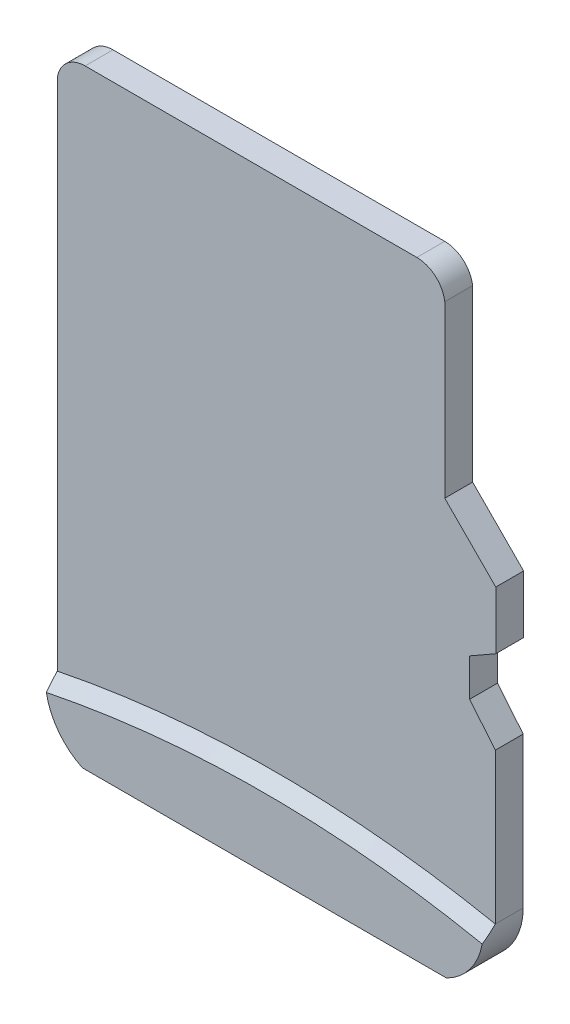
ISO-10303-21;
HEADER;
FILE_DESCRIPTION(('STEP AP214'),'2;1');
FILE_NAME('part.step','',(''),(''),'','','');
FILE_SCHEMA(('AUTOMOTIVE_DESIGN { 1 0 10303 214 1 1 1 1 }'));
ENDSEC;
DATA;
#1=APPLICATION_CONTEXT('core data for automotive mechanical design processes');
#2=APPLICATION_PROTOCOL_DEFINITION('international standard','automotive_design',2000,#1);
#3=PRODUCT_CONTEXT('',#1,'mechanical');
#4=PRODUCT('Part','Part','',(#3));
#5=PRODUCT_RELATED_PRODUCT_CATEGORY('part','',(#4));
#6=PRODUCT_DEFINITION_FORMATION('','',#4);
#7=PRODUCT_DEFINITION_CONTEXT('part definition',#1,'design');
#8=PRODUCT_DEFINITION('design','',#6,#7);
#9=PRODUCT_DEFINITION_SHAPE('','',#8);
#10=(LENGTH_UNIT() NAMED_UNIT(*) SI_UNIT(.MILLI.,.METRE.));
#11=(NAMED_UNIT(*) PLANE_ANGLE_UNIT() SI_UNIT($,.RADIAN.));
#12=(NAMED_UNIT(*) SI_UNIT($,.STERADIAN.) SOLID_ANGLE_UNIT());
#13=UNCERTAINTY_MEASURE_WITH_UNIT(LENGTH_MEASURE(1.E-05),#10,'distance_accuracy_value','');
#14=(GEOMETRIC_REPRESENTATION_CONTEXT(3) GLOBAL_UNCERTAINTY_ASSIGNED_CONTEXT((#13)) GLOBAL_UNIT_ASSIGNED_CONTEXT((#10,
#11,#12)) REPRESENTATION_CONTEXT('',''));
#15=CARTESIAN_POINT('',(0.,0.,0.));
#16=DIRECTION('',(0.,0.,1.));
#17=DIRECTION('',(1.,0.,0.));
#18=AXIS2_PLACEMENT_3D('',#15,#16,#17);
#19=CARTESIAN_POINT('',(23.959933723224,1.91827990787177,0.7));
#20=DIRECTION('',(0.,0.,1.));
#21=DIRECTION('',(1.,0.,0.));
#22=AXIS2_PLACEMENT_3D('',#19,#20,#21);
#23=PLANE('',#22);
#24=DIRECTION('',(2.81346803077018E-13,-1.,0.));
#25=VECTOR('',#24,1.);
#26=CARTESIAN_POINT('',(18.4539327369667,1.91827990787022,0.7));
#27=LINE('',#26,#25);
#28=CARTESIAN_POINT('',(18.4539327369607,23.4203809199612,0.7));
#29=VERTEX_POINT('',#28);
#30=CARTESIAN_POINT('',(18.4539327369643,10.5215618395466,0.7));
#31=VERTEX_POINT('',#30);
#32=EDGE_CURVE('E295',#29,#31,#27,.T.);
#33=ORIENTED_EDGE('',*,*,#32,.T.);
#34=CARTESIAN_POINT('',(23.9545115150179,-16.6696035780589,0.7));
#35=DIRECTION('',(0.,0.,1.));
#36=DIRECTION('',(1.,0.,0.));
#37=AXIS2_PLACEMENT_3D('',#34,#35,#36);
#38=CIRCLE('',#37,27.7419509707079);
#39=CARTESIAN_POINT('',(29.45509029309,10.5215618395429,0.7));
#40=VERTEX_POINT('',#39);
#41=EDGE_CURVE('E188',#31,#40,#38,.F.);
#42=ORIENTED_EDGE('',*,*,#41,.T.);
#43=DIRECTION('',(0.,-1.,0.));
#44=VECTOR('',#43,1.);
#45=CARTESIAN_POINT('',(29.45509029309,1.91827990787177,0.7));
#46=LINE('',#45,#44);
#47=CARTESIAN_POINT('',(29.45509029309,14.3034538287921,0.7));
#48=VERTEX_POINT('',#47);
#49=EDGE_CURVE('E297',#48,#40,#46,.T.);
#50=ORIENTED_EDGE('',*,*,#49,.F.);
#51=DIRECTION('',(0.635619317800836,-0.77200264432086,0.));
#52=VECTOR('',#51,1.);
#53=CARTESIAN_POINT('',(33.3123838453767,9.61850996555319,0.7));
#54=LINE('',#53,#52);
#55=CARTESIAN_POINT('',(28.8096789808155,15.0873495125709,0.7));
#56=VERTEX_POINT('',#55);
#57=EDGE_CURVE('E301',#56,#48,#54,.T.);
#58=ORIENTED_EDGE('',*,*,#57,.F.);
#59=DIRECTION('',(0.,-1.,0.));
#60=VECTOR('',#59,1.);
#61=CARTESIAN_POINT('',(28.8096789808155,1.91827990787177,0.7));
#62=LINE('',#61,#60);
#63=CARTESIAN_POINT('',(28.8096789808155,16.0307991680805,0.7));
#64=VERTEX_POINT('',#63);
#65=EDGE_CURVE('E308',#64,#56,#62,.T.);
#66=ORIENTED_EDGE('',*,*,#65,.F.);
#67=DIRECTION('',(0.868480025401258,0.495724162694366,0.));
#68=VECTOR('',#67,1.);
#69=CARTESIAN_POINT('',(19.075907988012,10.4748101595401,0.7));
#70=LINE('',#69,#68);
#71=CARTESIAN_POINT('',(29.4659653337916,16.4054042174787,0.7));
#72=VERTEX_POINT('',#71);
#73=EDGE_CURVE('E311',#64,#72,#70,.T.);
#74=ORIENTED_EDGE('',*,*,#73,.T.);
#75=DIRECTION('',(0.,-1.,0.));
#76=VECTOR('',#75,1.);
#77=CARTESIAN_POINT('',(29.4659653337916,1.91827990787177,0.7));
#78=LINE('',#77,#76);
#79=CARTESIAN_POINT('',(29.4659653337916,17.8560411369481,0.7));
#80=VERTEX_POINT('',#79);
#81=EDGE_CURVE('E176',#80,#72,#78,.T.);
#82=ORIENTED_EDGE('',*,*,#81,.F.);
#83=DIRECTION('',(0.704184265540735,-0.710017267511753,0.));
#84=VECTOR('',#83,1.);
#85=CARTESIAN_POINT('',(34.7042687489594,12.5743470417543,0.7));
#86=LINE('',#85,#84);
#87=CARTESIAN_POINT('',(28.1850891034887,19.147527308344,0.7));
#88=VERTEX_POINT('',#87);
#89=EDGE_CURVE('E162',#88,#80,#86,.T.);
#90=ORIENTED_EDGE('',*,*,#89,.F.);
#91=DIRECTION('',(-8.54196872922178E-13,-1.,0.));
#92=VECTOR('',#91,1.);
#93=CARTESIAN_POINT('',(28.185089103474,1.91827990786816,0.7));
#94=LINE('',#93,#92);
#95=CARTESIAN_POINT('',(28.1850891034923,23.4203809199116,0.7));
#96=VERTEX_POINT('',#95);
#97=EDGE_CURVE('E174',#96,#88,#94,.T.);
#98=ORIENTED_EDGE('',*,*,#97,.F.);
#99=CARTESIAN_POINT('',(27.4859645810288,23.3283197349789,0.7));
#100=DIRECTION('',(0.,0.,1.));
#101=DIRECTION('',(1.,0.,0.));
#102=AXIS2_PLACEMENT_3D('',#99,#100,#101);
#103=CIRCLE('',#102,0.705159811449334);
#104=CARTESIAN_POINT('',(27.4834451154169,24.0334750455159,0.7));
#105=VERTEX_POINT('',#104);
#106=EDGE_CURVE('E63',#96,#105,#103,.T.);
#107=ORIENTED_EDGE('',*,*,#106,.T.);
#108=DIRECTION('',(0.999999999999854,-5.40305386818244E-07,0.));
#109=VECTOR('',#108,1.);
#110=CARTESIAN_POINT('',(23.9599456721841,24.0334769492816,0.7));
#111=LINE('',#110,#109);
#112=CARTESIAN_POINT('',(19.1530572594242,24.0334795464693,0.7));
#113=VERTEX_POINT('',#112);
#114=EDGE_CURVE('E220',#113,#105,#111,.T.);
#115=ORIENTED_EDGE('',*,*,#114,.F.);
#116=CARTESIAN_POINT('',(19.1530572594242,23.3283197350216,0.7));
#117=DIRECTION('',(0.,0.,1.));
#118=DIRECTION('',(1.,0.,0.));
#119=AXIS2_PLACEMENT_3D('',#116,#117,#118);
#120=CIRCLE('',#119,0.705159811448242);
#121=EDGE_CURVE('E298',#113,#29,#120,.T.);
#122=ORIENTED_EDGE('',*,*,#121,.T.);
#123=EDGE_LOOP('',(#33,#42,#50,#58,#66,#74,#82,#90,#98,#107,#115,#122));
#124=FACE_BOUND('',#123,.T.);
#125=ADVANCED_FACE('F39',(#124),#23,.T.);
#126=CARTESIAN_POINT('',(23.9599456721841,24.0334769492816,0.7));
#127=DIRECTION('',(5.40305386818244E-07,0.999999999999854,0.));
#128=DIRECTION('',(-0.999999999999854,5.40305386818244E-07,0.));
#129=AXIS2_PLACEMENT_3D('',#126,#127,#128);
#130=PLANE('',#129);
#131=DIRECTION('',(0.999999999999854,-5.40305386818244E-07,0.));
#132=VECTOR('',#131,1.);
#133=CARTESIAN_POINT('',(23.9599456721841,24.0334769492816,0.));
#134=LINE('',#133,#132);
#135=CARTESIAN_POINT('',(19.1530572594242,24.0334795464693,0.));
#136=VERTEX_POINT('',#135);
#137=CARTESIAN_POINT('',(27.4834451154169,24.0334750455159,0.));
#138=VERTEX_POINT('',#137);
#139=EDGE_CURVE('E184',#136,#138,#134,.T.);
#140=ORIENTED_EDGE('',*,*,#139,.F.);
#141=DIRECTION('',(0.,0.,-1.));
#142=VECTOR('',#141,1.);
#143=CARTESIAN_POINT('',(19.1530572594242,24.0334795464693,0.7));
#144=LINE('',#143,#142);
#145=EDGE_CURVE('E11',#113,#136,#144,.T.);
#146=ORIENTED_EDGE('',*,*,#145,.F.);
#147=ORIENTED_EDGE('',*,*,#114,.T.);
#148=DIRECTION('',(0.,0.,-1.));
#149=VECTOR('',#148,1.);
#150=CARTESIAN_POINT('',(27.4834451154169,24.0334750455159,0.7));
#151=LINE('',#150,#149);
#152=EDGE_CURVE('E180',#105,#138,#151,.T.);
#153=ORIENTED_EDGE('',*,*,#152,.T.);
#154=EDGE_LOOP('',(#140,#146,#147,#153));
#155=FACE_BOUND('',#154,.T.);
#156=ADVANCED_FACE('F275',(#155),#130,.T.);
#157=CARTESIAN_POINT('',(19.1530572594242,23.3283197350216,0.7));
#158=DIRECTION('',(0.,0.,-1.));
#159=DIRECTION('',(-1.,0.,0.));
#160=AXIS2_PLACEMENT_3D('',#157,#158,#159);
#161=CYLINDRICAL_SURFACE('',#160,0.705159811448242);
#162=CARTESIAN_POINT('',(19.1530572594242,23.3283197350216,0.));
#163=DIRECTION('',(0.,0.,1.));
#164=DIRECTION('',(1.,0.,0.));
#165=AXIS2_PLACEMENT_3D('',#162,#163,#164);
#166=CIRCLE('',#165,0.705159811448242);
#167=CARTESIAN_POINT('',(18.4539327369607,23.4203809199612,0.));
#168=VERTEX_POINT('',#167);
#169=EDGE_CURVE('E187',#136,#168,#166,.T.);
#170=ORIENTED_EDGE('',*,*,#169,.T.);
#171=DIRECTION('',(0.,0.,-1.));
#172=VECTOR('',#171,1.);
#173=CARTESIAN_POINT('',(18.4539327369607,23.4203809199612,0.7));
#174=LINE('',#173,#172);
#175=EDGE_CURVE('E54',#29,#168,#174,.T.);
#176=ORIENTED_EDGE('',*,*,#175,.F.);
#177=ORIENTED_EDGE('',*,*,#121,.F.);
#178=ORIENTED_EDGE('',*,*,#145,.T.);
#179=EDGE_LOOP('',(#170,#176,#177,#178));
#180=FACE_BOUND('',#179,.T.);
#181=ADVANCED_FACE('F272',(#180),#161,.T.);
#182=CARTESIAN_POINT('',(18.4539327369667,1.91827990787022,0.7));
#183=DIRECTION('',(1.,2.81346803077018E-13,0.));
#184=DIRECTION('',(-2.81346803077018E-13,1.,0.));
#185=AXIS2_PLACEMENT_3D('',#182,#183,#184);
#186=PLANE('',#185);
#187=DIRECTION('',(2.81346803077018E-13,-1.,0.));
#188=VECTOR('',#187,1.);
#189=CARTESIAN_POINT('',(18.4539327369667,1.91827990787022,0.));
#190=LINE('',#189,#188);
#191=CARTESIAN_POINT('',(18.4539327369643,10.5215618395466,0.));
#192=VERTEX_POINT('',#191);
#193=EDGE_CURVE('E190',#168,#192,#190,.T.);
#194=ORIENTED_EDGE('',*,*,#193,.T.);
#195=DIRECTION('',(0.,0.,-1.));
#196=VECTOR('',#195,1.);
#197=CARTESIAN_POINT('',(18.4539327369643,10.5215618395466,0.7));
#198=LINE('',#197,#196);
#199=EDGE_CURVE('E238',#31,#192,#198,.T.);
#200=ORIENTED_EDGE('',*,*,#199,.F.);
#201=ORIENTED_EDGE('',*,*,#32,.F.);
#202=ORIENTED_EDGE('',*,*,#175,.T.);
#203=EDGE_LOOP('',(#194,#200,#201,#202));
#204=FACE_BOUND('',#203,.T.);
#205=ADVANCED_FACE('F268',(#204),#186,.F.);
#206=CARTESIAN_POINT('',(20.0948226540754,10.5115367125023,0.7));
#207=DIRECTION('',(0.,0.,-1.));
#208=DIRECTION('',(-1.,0.,0.));
#209=AXIS2_PLACEMENT_3D('',#206,#207,#208);
#210=CYLINDRICAL_SURFACE('',#209,1.64092054141899);
#211=CARTESIAN_POINT('',(20.0948226540754,10.5115367125023,0.));
#212=DIRECTION('',(0.,0.,1.));
#213=DIRECTION('',(1.,0.,0.));
#214=AXIS2_PLACEMENT_3D('',#211,#212,#213);
#215=CIRCLE('',#214,1.64092054141899);
#216=CARTESIAN_POINT('',(19.3820795486301,9.033491554568,0.));
#217=VERTEX_POINT('',#216);
#218=EDGE_CURVE('E192',#192,#217,#215,.T.);
#219=ORIENTED_EDGE('',*,*,#218,.T.);
#220=DIRECTION('',(0.,0.,-1.));
#221=VECTOR('',#220,1.);
#222=CARTESIAN_POINT('',(19.3820795486301,9.033491554568,0.7));
#223=LINE('',#222,#221);
#224=CARTESIAN_POINT('',(19.3820795486301,9.033491554568,1.));
#225=VERTEX_POINT('',#224);
#226=EDGE_CURVE('E235',#225,#217,#223,.T.);
#227=ORIENTED_EDGE('',*,*,#226,.F.);
#228=CARTESIAN_POINT('',(20.0948226540753,10.511536712501,1.));
#229=DIRECTION('',(0.,0.,1.));
#230=DIRECTION('',(-1.,0.,0.));
#231=AXIS2_PLACEMENT_3D('',#228,#229,#230);
#232=CIRCLE('',#231,1.64092054141835);
#233=CARTESIAN_POINT('',(18.4798795363341,10.2207121095025,1.));
#234=VERTEX_POINT('',#233);
#235=EDGE_CURVE('E246',#234,#225,#232,.T.);
#236=ORIENTED_EDGE('',*,*,#235,.F.);
#237=CARTESIAN_POINT('',(18.4798795363341,10.2207121095025,1.));
#238=CARTESIAN_POINT('',(18.4709542851157,10.2701930916234,0.949735408039186));
#239=CARTESIAN_POINT('',(18.4643294262255,10.3200043935154,0.899603112064133));
#240=CARTESIAN_POINT('',(18.4556804931001,10.4202876368632,0.799603112064017));
#241=CARTESIAN_POINT('',(18.4536564188668,10.4707595783192,0.749735408039069));
#242=CARTESIAN_POINT('',(18.4539327369638,10.5215618395465,0.699999999999996));
#243=B_SPLINE_CURVE_WITH_KNOTS('',3,(#237,#238,#239,#240,#241,#242),.UNSPECIFIED.,.F.,.F.,(4,2,
4),(0.,0.212942985000667,0.425885970093028),.UNSPECIFIED.);
#244=EDGE_CURVE('E44',#234,#31,#243,.T.);
#245=ORIENTED_EDGE('',*,*,#244,.T.);
#246=ORIENTED_EDGE('',*,*,#199,.T.);
#247=EDGE_LOOP('',(#219,#227,#236,#245,#246));
#248=FACE_BOUND('',#247,.T.);
#249=ADVANCED_FACE('F264',(#248),#210,.T.);
#250=CARTESIAN_POINT('',(23.9599337232889,9.03349155452627,0.7));
#251=DIRECTION('',(9.11516377739171E-12,1.,0.));
#252=DIRECTION('',(-1.,9.11516377739171E-12,0.));
#253=AXIS2_PLACEMENT_3D('',#250,#251,#252);
#254=PLANE('',#253);
#255=DIRECTION('',(1.,-9.11516377739171E-12,0.));
#256=VECTOR('',#255,1.);
#257=CARTESIAN_POINT('',(23.9599337232889,9.03349155452627,0.));
#258=LINE('',#257,#256);
#259=CARTESIAN_POINT('',(28.526943481233,9.03349155448464,0.));
#260=VERTEX_POINT('',#259);
#261=EDGE_CURVE('E194',#217,#260,#258,.T.);
#262=ORIENTED_EDGE('',*,*,#261,.T.);
#263=DIRECTION('',(0.,0.,-1.));
#264=VECTOR('',#263,1.);
#265=CARTESIAN_POINT('',(28.526943481233,9.03349155448464,0.7));
#266=LINE('',#265,#264);
#267=CARTESIAN_POINT('',(28.526943481233,9.03349155448464,1.));
#268=VERTEX_POINT('',#267);
#269=EDGE_CURVE('E127',#268,#260,#266,.T.);
#270=ORIENTED_EDGE('',*,*,#269,.F.);
#271=DIRECTION('',(1.,-9.11516377739171E-12,0.));
#272=VECTOR('',#271,1.);
#273=CARTESIAN_POINT('',(19.3820795486301,9.033491554568,1.));
#274=LINE('',#273,#272);
#275=EDGE_CURVE('E245',#225,#268,#274,.T.);
#276=ORIENTED_EDGE('',*,*,#275,.F.);
#277=ORIENTED_EDGE('',*,*,#226,.T.);
#278=EDGE_LOOP('',(#262,#270,#276,#277));
#279=FACE_BOUND('',#278,.T.);
#280=ADVANCED_FACE('F260',(#279),#254,.F.);
#281=CARTESIAN_POINT('',(27.7888285020603,10.5273617875264,0.7));
#282=DIRECTION('',(0.,0.,-1.));
#283=DIRECTION('',(-1.,0.,0.));
#284=AXIS2_PLACEMENT_3D('',#281,#282,#283);
#285=CYLINDRICAL_SURFACE('',#284,1.66627188527104);
#286=CARTESIAN_POINT('',(27.7888285020603,10.5273617875264,0.));
#287=DIRECTION('',(0.,0.,1.));
#288=DIRECTION('',(1.,0.,0.));
#289=AXIS2_PLACEMENT_3D('',#286,#287,#288);
#290=CIRCLE('',#289,1.66627188527104);
#291=CARTESIAN_POINT('',(29.45509029309,10.5215618395429,0.));
#292=VERTEX_POINT('',#291);
#293=EDGE_CURVE('E196',#260,#292,#290,.T.);
#294=ORIENTED_EDGE('',*,*,#293,.T.);
#295=DIRECTION('',(0.,0.,-1.));
#296=VECTOR('',#295,1.);
#297=CARTESIAN_POINT('',(29.45509029309,10.5215618395429,0.7));
#298=LINE('',#297,#296);
#299=EDGE_CURVE('E232',#40,#292,#298,.T.);
#300=ORIENTED_EDGE('',*,*,#299,.F.);
#301=CARTESIAN_POINT('',(29.2537860070381,9.7334087005911,1.51238789351859));
#302=CARTESIAN_POINT('',(29.2803801731756,9.78251047923255,1.45901144865288));
#303=CARTESIAN_POINT('',(29.3043177233163,9.83253824211502,1.40523804850298));
#304=CARTESIAN_POINT('',(29.3469379449529,9.93422600016491,1.29711943171935));
#305=CARTESIAN_POINT('',(29.3656190381277,9.98588648040922,1.24277404841069));
#306=CARTESIAN_POINT('',(29.4134321716254,10.1416018398551,1.08065709052752));
#307=CARTESIAN_POINT('',(29.4350107566258,10.2476605123627,0.972425538884719));
#308=CARTESIAN_POINT('',(29.4490375362642,10.3826825061088,0.83731364337082));
#309=CARTESIAN_POINT('',(29.4512137993634,10.410286147514,0.809829245481));
#310=CARTESIAN_POINT('',(29.4541932084279,10.4657536303997,0.754876564047817));
#311=CARTESIAN_POINT('',(29.454992069985,10.4936180136675,0.727408595503557));
#312=CARTESIAN_POINT('',(29.4550902930909,10.5215618395428,0.699999999999919));
#313=B_SPLINE_CURVE_WITH_KNOTS('',3,(#301,#302,#303,#304,#305,#306,#307,#308,#309,#310,#311,
#312),.UNSPECIFIED.,.F.,.F.,(4,2,2,2,2,4),(0.,0.231595135453855,0.46325973639887,
0.920658272538868,1.03768812061169,1.15508133777267),.UNSPECIFIED.);
#314=CARTESIAN_POINT('',(29.4267322637467,10.2212029021476,1.));
#315=VERTEX_POINT('',#314);
#316=EDGE_CURVE('E249',#315,#40,#313,.T.);
#317=ORIENTED_EDGE('',*,*,#316,.F.);
#318=CARTESIAN_POINT('',(27.7888285020592,10.5273617875253,1.));
#319=DIRECTION('',(0.,0.,1.));
#320=DIRECTION('',(-1.,0.,0.));
#321=AXIS2_PLACEMENT_3D('',#318,#319,#320);
#322=CIRCLE('',#321,1.66627188527133);
#323=EDGE_CURVE('E119',#268,#315,#322,.T.);
#324=ORIENTED_EDGE('',*,*,#323,.F.);
#325=ORIENTED_EDGE('',*,*,#269,.T.);
#326=EDGE_LOOP('',(#294,#300,#317,#324,#325));
#327=FACE_BOUND('',#326,.T.);
#328=ADVANCED_FACE('F254',(#327),#285,.T.);
#329=CARTESIAN_POINT('',(29.45509029309,1.91827990787177,0.7));
#330=DIRECTION('',(1.,0.,0.));
#331=DIRECTION('',(0.,0.,-1.));
#332=AXIS2_PLACEMENT_3D('',#329,#330,#331);
#333=PLANE('',#332);
#334=DIRECTION('',(0.,-1.,0.));
#335=VECTOR('',#334,1.);
#336=CARTESIAN_POINT('',(29.45509029309,1.91827990787177,0.));
#337=LINE('',#336,#335);
#338=CARTESIAN_POINT('',(29.45509029309,14.3034538287921,0.));
#339=VERTEX_POINT('',#338);
#340=EDGE_CURVE('E199',#339,#292,#337,.T.);
#341=ORIENTED_EDGE('',*,*,#340,.F.);
#342=DIRECTION('',(0.,0.,-1.));
#343=VECTOR('',#342,1.);
#344=CARTESIAN_POINT('',(29.45509029309,14.3034538287921,0.7));
#345=LINE('',#344,#343);
#346=EDGE_CURVE('E230',#48,#339,#345,.T.);
#347=ORIENTED_EDGE('',*,*,#346,.F.);
#348=ORIENTED_EDGE('',*,*,#49,.T.);
#349=ORIENTED_EDGE('',*,*,#299,.T.);
#350=EDGE_LOOP('',(#341,#347,#348,#349));
#351=FACE_BOUND('',#350,.T.);
#352=ADVANCED_FACE('F259',(#351),#333,.T.);
#353=CARTESIAN_POINT('',(33.3123838453767,9.61850996555319,0.7));
#354=DIRECTION('',(0.77200264432086,0.635619317800836,0.));
#355=DIRECTION('',(-0.635619317800836,0.77200264432086,0.));
#356=AXIS2_PLACEMENT_3D('',#353,#354,#355);
#357=PLANE('',#356);
#358=DIRECTION('',(0.635619317800836,-0.77200264432086,0.));
#359=VECTOR('',#358,1.);
#360=CARTESIAN_POINT('',(33.3123838453767,9.61850996555319,0.));
#361=LINE('',#360,#359);
#362=CARTESIAN_POINT('',(28.8096789808155,15.0873495125709,0.));
#363=VERTEX_POINT('',#362);
#364=EDGE_CURVE('E202',#363,#339,#361,.T.);
#365=ORIENTED_EDGE('',*,*,#364,.F.);
#366=DIRECTION('',(0.,0.,-1.));
#367=VECTOR('',#366,1.);
#368=CARTESIAN_POINT('',(28.8096789808155,15.0873495125709,0.7));
#369=LINE('',#368,#367);
#370=EDGE_CURVE('E228',#56,#363,#369,.T.);
#371=ORIENTED_EDGE('',*,*,#370,.F.);
#372=ORIENTED_EDGE('',*,*,#57,.T.);
#373=ORIENTED_EDGE('',*,*,#346,.T.);
#374=EDGE_LOOP('',(#365,#371,#372,#373));
#375=FACE_BOUND('',#374,.T.);
#376=ADVANCED_FACE('F326',(#375),#357,.T.);
#377=CARTESIAN_POINT('',(28.8096789808155,1.91827990787177,0.7));
#378=DIRECTION('',(1.,0.,0.));
#379=DIRECTION('',(0.,0.,-1.));
#380=AXIS2_PLACEMENT_3D('',#377,#378,#379);
#381=PLANE('',#380);
#382=DIRECTION('',(0.,-1.,0.));
#383=VECTOR('',#382,1.);
#384=CARTESIAN_POINT('',(28.8096789808155,1.91827990787177,0.));
#385=LINE('',#384,#383);
#386=CARTESIAN_POINT('',(28.8096789808155,16.0307991680805,0.));
#387=VERTEX_POINT('',#386);
#388=EDGE_CURVE('E205',#387,#363,#385,.T.);
#389=ORIENTED_EDGE('',*,*,#388,.F.);
#390=DIRECTION('',(0.,0.,-1.));
#391=VECTOR('',#390,1.);
#392=CARTESIAN_POINT('',(28.8096789808155,16.0307991680805,0.7));
#393=LINE('',#392,#391);
#394=EDGE_CURVE('E226',#64,#387,#393,.T.);
#395=ORIENTED_EDGE('',*,*,#394,.F.);
#396=ORIENTED_EDGE('',*,*,#65,.T.);
#397=ORIENTED_EDGE('',*,*,#370,.T.);
#398=EDGE_LOOP('',(#389,#395,#396,#397));
#399=FACE_BOUND('',#398,.T.);
#400=ADVANCED_FACE('F320',(#399),#381,.T.);
#401=CARTESIAN_POINT('',(19.075907988012,10.4748101595401,0.7));
#402=DIRECTION('',(-0.495724162694366,0.868480025401258,0.));
#403=DIRECTION('',(-0.868480025401258,-0.495724162694366,0.));
#404=AXIS2_PLACEMENT_3D('',#401,#402,#403);
#405=PLANE('',#404);
#406=DIRECTION('',(0.868480025401258,0.495724162694366,0.));
#407=VECTOR('',#406,1.);
#408=CARTESIAN_POINT('',(19.075907988012,10.4748101595401,0.));
#409=LINE('',#408,#407);
#410=CARTESIAN_POINT('',(29.4659653337916,16.4054042174787,0.));
#411=VERTEX_POINT('',#410);
#412=EDGE_CURVE('E208',#387,#411,#409,.T.);
#413=ORIENTED_EDGE('',*,*,#412,.T.);
#414=DIRECTION('',(0.,0.,-1.));
#415=VECTOR('',#414,1.);
#416=CARTESIAN_POINT('',(29.4659653337916,16.4054042174787,0.7));
#417=LINE('',#416,#415);
#418=EDGE_CURVE('E224',#72,#411,#417,.T.);
#419=ORIENTED_EDGE('',*,*,#418,.F.);
#420=ORIENTED_EDGE('',*,*,#73,.F.);
#421=ORIENTED_EDGE('',*,*,#394,.T.);
#422=EDGE_LOOP('',(#413,#419,#420,#421));
#423=FACE_BOUND('',#422,.T.);
#424=ADVANCED_FACE('F341',(#423),#405,.F.);
#425=CARTESIAN_POINT('',(29.4659653337916,1.91827990787177,0.7));
#426=DIRECTION('',(1.,0.,0.));
#427=DIRECTION('',(0.,0.,-1.));
#428=AXIS2_PLACEMENT_3D('',#425,#426,#427);
#429=PLANE('',#428);
#430=DIRECTION('',(0.,-1.,0.));
#431=VECTOR('',#430,1.);
#432=CARTESIAN_POINT('',(29.4659653337916,1.91827990787177,0.));
#433=LINE('',#432,#431);
#434=CARTESIAN_POINT('',(29.4659653337916,17.8560411369481,0.));
#435=VERTEX_POINT('',#434);
#436=EDGE_CURVE('E211',#435,#411,#433,.T.);
#437=ORIENTED_EDGE('',*,*,#436,.F.);
#438=DIRECTION('',(0.,0.,-1.));
#439=VECTOR('',#438,1.);
#440=CARTESIAN_POINT('',(29.4659653337916,17.8560411369481,0.7));
#441=LINE('',#440,#439);
#442=EDGE_CURVE('E169',#80,#435,#441,.T.);
#443=ORIENTED_EDGE('',*,*,#442,.F.);
#444=ORIENTED_EDGE('',*,*,#81,.T.);
#445=ORIENTED_EDGE('',*,*,#418,.T.);
#446=EDGE_LOOP('',(#437,#443,#444,#445));
#447=FACE_BOUND('',#446,.T.);
#448=ADVANCED_FACE('F314',(#447),#429,.T.);
#449=CARTESIAN_POINT('',(34.7042687489594,12.5743470417543,0.7));
#450=DIRECTION('',(0.710017267511753,0.704184265540735,0.));
#451=DIRECTION('',(-0.704184265540735,0.710017267511753,0.));
#452=AXIS2_PLACEMENT_3D('',#449,#450,#451);
#453=PLANE('',#452);
#454=DIRECTION('',(0.704184265540735,-0.710017267511753,0.));
#455=VECTOR('',#454,1.);
#456=CARTESIAN_POINT('',(34.7042687489594,12.5743470417543,0.));
#457=LINE('',#456,#455);
#458=CARTESIAN_POINT('',(28.1850891034887,19.147527308344,0.));
#459=VERTEX_POINT('',#458);
#460=EDGE_CURVE('E164',#459,#435,#457,.T.);
#461=ORIENTED_EDGE('',*,*,#460,.F.);
#462=DIRECTION('',(0.,0.,-1.));
#463=VECTOR('',#462,1.);
#464=CARTESIAN_POINT('',(28.1850891034887,19.147527308344,0.7));
#465=LINE('',#464,#463);
#466=EDGE_CURVE('E159',#88,#459,#465,.T.);
#467=ORIENTED_EDGE('',*,*,#466,.F.);
#468=ORIENTED_EDGE('',*,*,#89,.T.);
#469=ORIENTED_EDGE('',*,*,#442,.T.);
#470=EDGE_LOOP('',(#461,#467,#468,#469));
#471=FACE_BOUND('',#470,.T.);
#472=ADVANCED_FACE('F161',(#471),#453,.T.);
#473=CARTESIAN_POINT('',(28.185089103474,1.91827990786816,0.7));
#474=DIRECTION('',(1.,-8.54196872922178E-13,0.));
#475=DIRECTION('',(8.54196872922178E-13,1.,0.));
#476=AXIS2_PLACEMENT_3D('',#473,#474,#475);
#477=PLANE('',#476);
#478=DIRECTION('',(-8.54196872922178E-13,-1.,0.));
#479=VECTOR('',#478,1.);
#480=CARTESIAN_POINT('',(28.185089103474,1.91827990786816,0.));
#481=LINE('',#480,#479);
#482=CARTESIAN_POINT('',(28.1850891034923,23.4203809199116,0.));
#483=VERTEX_POINT('',#482);
#484=EDGE_CURVE('E215',#483,#459,#481,.T.);
#485=ORIENTED_EDGE('',*,*,#484,.F.);
#486=DIRECTION('',(0.,0.,-1.));
#487=VECTOR('',#486,1.);
#488=CARTESIAN_POINT('',(28.1850891034923,23.4203809199116,0.7));
#489=LINE('',#488,#487);
#490=EDGE_CURVE('E170',#96,#483,#489,.T.);
#491=ORIENTED_EDGE('',*,*,#490,.F.);
#492=ORIENTED_EDGE('',*,*,#97,.T.);
#493=ORIENTED_EDGE('',*,*,#466,.T.);
#494=EDGE_LOOP('',(#485,#491,#492,#493));
#495=FACE_BOUND('',#494,.T.);
#496=ADVANCED_FACE('F178',(#495),#477,.T.);
#497=CARTESIAN_POINT('',(27.4859645810288,23.3283197349789,0.7));
#498=DIRECTION('',(0.,0.,-1.));
#499=DIRECTION('',(-1.,0.,0.));
#500=AXIS2_PLACEMENT_3D('',#497,#498,#499);
#501=CYLINDRICAL_SURFACE('',#500,0.705159811449334);
#502=CARTESIAN_POINT('',(27.4859645810288,23.3283197349789,0.));
#503=DIRECTION('',(0.,0.,1.));
#504=DIRECTION('',(1.,0.,0.));
#505=AXIS2_PLACEMENT_3D('',#502,#503,#504);
#506=CIRCLE('',#505,0.705159811449334);
#507=EDGE_CURVE('E217',#483,#138,#506,.T.);
#508=ORIENTED_EDGE('',*,*,#507,.T.);
#509=ORIENTED_EDGE('',*,*,#152,.F.);
#510=ORIENTED_EDGE('',*,*,#106,.F.);
#511=ORIENTED_EDGE('',*,*,#490,.T.);
#512=EDGE_LOOP('',(#508,#509,#510,#511));
#513=FACE_BOUND('',#512,.T.);
#514=ADVANCED_FACE('F418',(#513),#501,.T.);
#515=CARTESIAN_POINT('',(23.959933723224,1.91827990787177,0.));
#516=DIRECTION('',(0.,0.,1.));
#517=DIRECTION('',(1.,0.,0.));
#518=AXIS2_PLACEMENT_3D('',#515,#516,#517);
#519=PLANE('',#518);
#520=ORIENTED_EDGE('',*,*,#218,.F.);
#521=ORIENTED_EDGE('',*,*,#193,.F.);
#522=ORIENTED_EDGE('',*,*,#169,.F.);
#523=ORIENTED_EDGE('',*,*,#139,.T.);
#524=ORIENTED_EDGE('',*,*,#507,.F.);
#525=ORIENTED_EDGE('',*,*,#484,.T.);
#526=ORIENTED_EDGE('',*,*,#460,.T.);
#527=ORIENTED_EDGE('',*,*,#436,.T.);
#528=ORIENTED_EDGE('',*,*,#412,.F.);
#529=ORIENTED_EDGE('',*,*,#388,.T.);
#530=ORIENTED_EDGE('',*,*,#364,.T.);
#531=ORIENTED_EDGE('',*,*,#340,.T.);
#532=ORIENTED_EDGE('',*,*,#293,.F.);
#533=ORIENTED_EDGE('',*,*,#261,.F.);
#534=EDGE_LOOP('',(#520,#521,#522,#523,#524,#525,#526,#527,#528,#529,#530,#531,#532,#533));
#535=FACE_BOUND('',#534,.T.);
#536=ADVANCED_FACE('F290',(#535),#519,.F.);
#537=CARTESIAN_POINT('',(23.9545115150179,-16.6696035780589,0.7));
#538=DIRECTION('',(0.,0.,-1.));
#539=DIRECTION('',(1.,0.,0.));
#540=AXIS2_PLACEMENT_3D('',#537,#538,#539);
#541=CONICAL_SURFACE('',#540,27.7419509707079,0.78539816339745);
#542=ORIENTED_EDGE('',*,*,#41,.F.);
#543=ORIENTED_EDGE('',*,*,#244,.F.);
#544=CARTESIAN_POINT('',(23.9545115150179,-16.6696035780589,1.));
#545=DIRECTION('',(0.,0.,-1.));
#546=DIRECTION('',(-1.,0.,0.));
#547=AXIS2_PLACEMENT_3D('',#544,#545,#546);
#548=CIRCLE('',#547,27.4419509707079);
#549=EDGE_CURVE('E244',#315,#234,#548,.F.);
#550=ORIENTED_EDGE('',*,*,#549,.F.);
#551=ORIENTED_EDGE('',*,*,#316,.T.);
#552=EDGE_LOOP('',(#542,#543,#550,#551));
#553=FACE_BOUND('',#552,.T.);
#554=ADVANCED_FACE('F41',(#553),#541,.T.);
#555=CARTESIAN_POINT('',(20.0948226540753,10.511536712501,1.));
#556=DIRECTION('',(0.,0.,-1.));
#557=DIRECTION('',(-1.,0.,0.));
#558=AXIS2_PLACEMENT_3D('',#555,#556,#557);
#559=PLANE('',#558);
#560=ORIENTED_EDGE('',*,*,#235,.T.);
#561=ORIENTED_EDGE('',*,*,#275,.T.);
#562=ORIENTED_EDGE('',*,*,#323,.T.);
#563=ORIENTED_EDGE('',*,*,#549,.T.);
#564=EDGE_LOOP('',(#560,#561,#562,#563));
#565=FACE_BOUND('',#564,.T.);
#566=ADVANCED_FACE('F338',(#565),#559,.F.);
#567=CLOSED_SHELL('',(#125,#156,#181,#205,#249,#280,#328,#352,#376,#400,#424,#448,#472,#496,
#514,#536,#554,#566));
#568=MANIFOLD_SOLID_BREP('B2',#567);
#569=ADVANCED_BREP_SHAPE_REPRESENTATION('',(#18,#568),#14);
#570=SHAPE_DEFINITION_REPRESENTATION(#9,#569);
ENDSEC;
END-ISO-10303-21;
